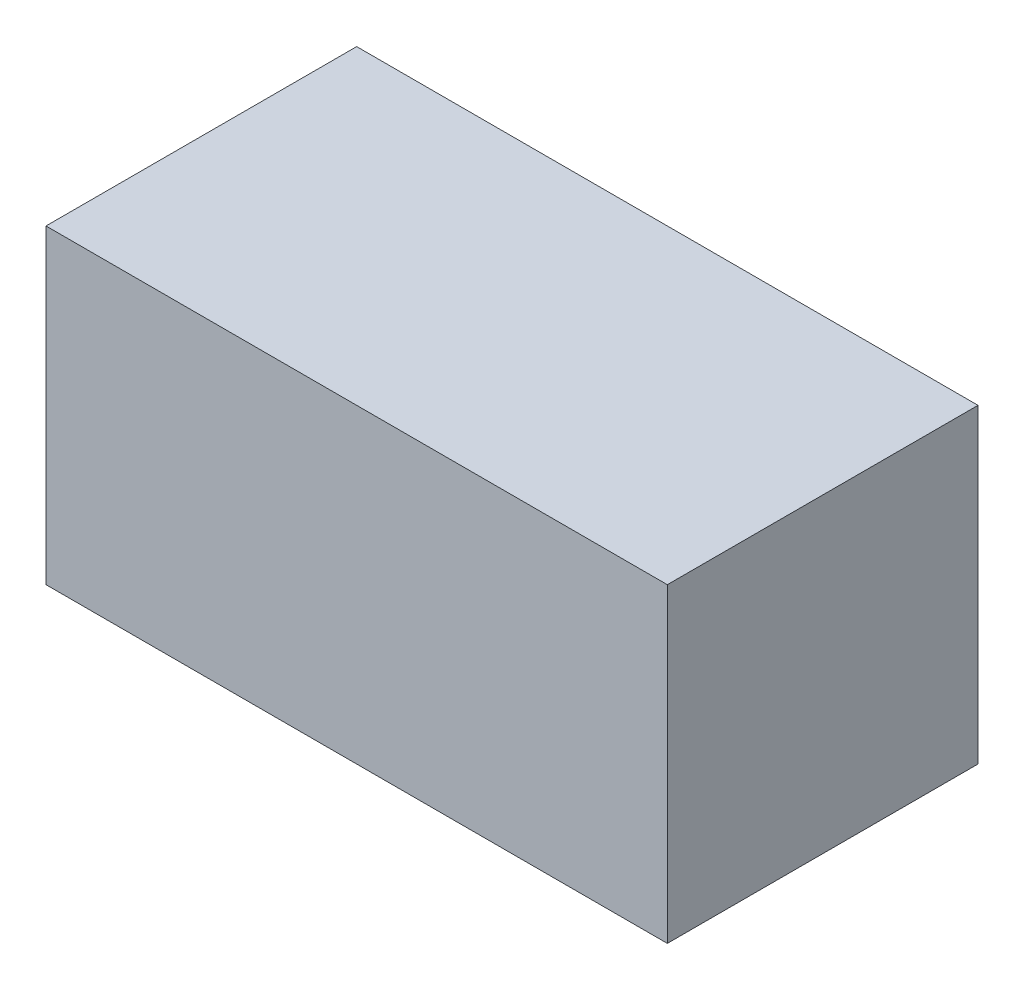
ISO-10303-21;
HEADER;
FILE_DESCRIPTION(('STEP AP214'),'2;1');
FILE_NAME('part.step','',(''),(''),'','','');
FILE_SCHEMA(('AUTOMOTIVE_DESIGN { 1 0 10303 214 1 1 1 1 }'));
ENDSEC;
DATA;
#1=APPLICATION_CONTEXT('core data for automotive mechanical design processes');
#2=APPLICATION_PROTOCOL_DEFINITION('international standard','automotive_design',2000,#1);
#3=PRODUCT_CONTEXT('',#1,'mechanical');
#4=PRODUCT('Part','Part','',(#3));
#5=PRODUCT_RELATED_PRODUCT_CATEGORY('part','',(#4));
#6=PRODUCT_DEFINITION_FORMATION('','',#4);
#7=PRODUCT_DEFINITION_CONTEXT('part definition',#1,'design');
#8=PRODUCT_DEFINITION('design','',#6,#7);
#9=PRODUCT_DEFINITION_SHAPE('','',#8);
#10=(LENGTH_UNIT() NAMED_UNIT(*) SI_UNIT(.MILLI.,.METRE.));
#11=(NAMED_UNIT(*) PLANE_ANGLE_UNIT() SI_UNIT($,.RADIAN.));
#12=(NAMED_UNIT(*) SI_UNIT($,.STERADIAN.) SOLID_ANGLE_UNIT());
#13=UNCERTAINTY_MEASURE_WITH_UNIT(LENGTH_MEASURE(1.E-05),#10,'distance_accuracy_value','');
#14=(GEOMETRIC_REPRESENTATION_CONTEXT(3) GLOBAL_UNCERTAINTY_ASSIGNED_CONTEXT((#13)) GLOBAL_UNIT_ASSIGNED_CONTEXT((#10,
#11,#12)) REPRESENTATION_CONTEXT('',''));
#15=CARTESIAN_POINT('',(0.,0.,0.));
#16=DIRECTION('',(0.,0.,1.));
#17=DIRECTION('',(1.,0.,0.));
#18=AXIS2_PLACEMENT_3D('',#15,#16,#17);
#19=CARTESIAN_POINT('',(0.,10.,0.));
#20=DIRECTION('',(1.,0.,0.));
#21=DIRECTION('',(0.,0.,-1.));
#22=AXIS2_PLACEMENT_3D('',#19,#20,#21);
#23=PLANE('',#22);
#24=DIRECTION('',(0.,0.,1.));
#25=VECTOR('',#24,1.);
#26=CARTESIAN_POINT('',(0.,0.,0.));
#27=LINE('',#26,#25);
#28=CARTESIAN_POINT('',(0.,0.,-10.));
#29=VERTEX_POINT('',#28);
#30=CARTESIAN_POINT('',(0.,0.,0.));
#31=VERTEX_POINT('',#30);
#32=EDGE_CURVE('E96',#29,#31,#27,.T.);
#33=ORIENTED_EDGE('',*,*,#32,.T.);
#34=DIRECTION('',(0.,-1.,0.));
#35=VECTOR('',#34,1.);
#36=CARTESIAN_POINT('',(0.,10.,0.));
#37=LINE('',#36,#35);
#38=CARTESIAN_POINT('',(0.,10.,0.));
#39=VERTEX_POINT('',#38);
#40=EDGE_CURVE('E11',#39,#31,#37,.T.);
#41=ORIENTED_EDGE('',*,*,#40,.F.);
#42=DIRECTION('',(0.,0.,1.));
#43=VECTOR('',#42,1.);
#44=CARTESIAN_POINT('',(0.,10.,0.));
#45=LINE('',#44,#43);
#46=CARTESIAN_POINT('',(0.,10.,-10.));
#47=VERTEX_POINT('',#46);
#48=EDGE_CURVE('E84',#47,#39,#45,.T.);
#49=ORIENTED_EDGE('',*,*,#48,.F.);
#50=DIRECTION('',(0.,-1.,0.));
#51=VECTOR('',#50,1.);
#52=CARTESIAN_POINT('',(0.,10.,-10.));
#53=LINE('',#52,#51);
#54=EDGE_CURVE('E92',#47,#29,#53,.T.);
#55=ORIENTED_EDGE('',*,*,#54,.T.);
#56=EDGE_LOOP('',(#33,#41,#49,#55));
#57=FACE_BOUND('',#56,.T.);
#58=ADVANCED_FACE('F33',(#57),#23,.F.);
#59=CARTESIAN_POINT('',(0.,10.,0.));
#60=DIRECTION('',(0.,0.,-1.));
#61=DIRECTION('',(-1.,0.,0.));
#62=AXIS2_PLACEMENT_3D('',#59,#60,#61);
#63=PLANE('',#62);
#64=DIRECTION('',(1.,0.,0.));
#65=VECTOR('',#64,1.);
#66=CARTESIAN_POINT('',(0.,0.,0.));
#67=LINE('',#66,#65);
#68=CARTESIAN_POINT('',(20.,0.,0.));
#69=VERTEX_POINT('',#68);
#70=EDGE_CURVE('E88',#31,#69,#67,.T.);
#71=ORIENTED_EDGE('',*,*,#70,.T.);
#72=DIRECTION('',(0.,-1.,0.));
#73=VECTOR('',#72,1.);
#74=CARTESIAN_POINT('',(20.,10.,0.));
#75=LINE('',#74,#73);
#76=CARTESIAN_POINT('',(20.,10.,0.));
#77=VERTEX_POINT('',#76);
#78=EDGE_CURVE('E41',#77,#69,#75,.T.);
#79=ORIENTED_EDGE('',*,*,#78,.F.);
#80=DIRECTION('',(1.,0.,0.));
#81=VECTOR('',#80,1.);
#82=CARTESIAN_POINT('',(0.,10.,0.));
#83=LINE('',#82,#81);
#84=EDGE_CURVE('E79',#39,#77,#83,.T.);
#85=ORIENTED_EDGE('',*,*,#84,.F.);
#86=ORIENTED_EDGE('',*,*,#40,.T.);
#87=EDGE_LOOP('',(#71,#79,#85,#86));
#88=FACE_BOUND('',#87,.T.);
#89=ADVANCED_FACE('F87',(#88),#63,.F.);
#90=CARTESIAN_POINT('',(20.,10.,0.));
#91=DIRECTION('',(-1.,0.,0.));
#92=DIRECTION('',(0.,0.,1.));
#93=AXIS2_PLACEMENT_3D('',#90,#91,#92);
#94=PLANE('',#93);
#95=DIRECTION('',(0.,0.,-1.));
#96=VECTOR('',#95,1.);
#97=CARTESIAN_POINT('',(20.,0.,0.));
#98=LINE('',#97,#96);
#99=CARTESIAN_POINT('',(20.,0.,-10.));
#100=VERTEX_POINT('',#99);
#101=EDGE_CURVE('E66',#69,#100,#98,.T.);
#102=ORIENTED_EDGE('',*,*,#101,.T.);
#103=DIRECTION('',(0.,-1.,0.));
#104=VECTOR('',#103,1.);
#105=CARTESIAN_POINT('',(20.,10.,-10.));
#106=LINE('',#105,#104);
#107=CARTESIAN_POINT('',(20.,10.,-10.));
#108=VERTEX_POINT('',#107);
#109=EDGE_CURVE('E89',#108,#100,#106,.T.);
#110=ORIENTED_EDGE('',*,*,#109,.F.);
#111=DIRECTION('',(0.,0.,-1.));
#112=VECTOR('',#111,1.);
#113=CARTESIAN_POINT('',(20.,10.,0.));
#114=LINE('',#113,#112);
#115=EDGE_CURVE('E82',#77,#108,#114,.T.);
#116=ORIENTED_EDGE('',*,*,#115,.F.);
#117=ORIENTED_EDGE('',*,*,#78,.T.);
#118=EDGE_LOOP('',(#102,#110,#116,#117));
#119=FACE_BOUND('',#118,.T.);
#120=ADVANCED_FACE('F90',(#119),#94,.F.);
#121=CARTESIAN_POINT('',(0.,10.,-10.));
#122=DIRECTION('',(0.,0.,1.));
#123=DIRECTION('',(1.,0.,0.));
#124=AXIS2_PLACEMENT_3D('',#121,#122,#123);
#125=PLANE('',#124);
#126=DIRECTION('',(-1.,0.,0.));
#127=VECTOR('',#126,1.);
#128=CARTESIAN_POINT('',(0.,0.,-10.));
#129=LINE('',#128,#127);
#130=EDGE_CURVE('E72',#100,#29,#129,.T.);
#131=ORIENTED_EDGE('',*,*,#130,.T.);
#132=ORIENTED_EDGE('',*,*,#54,.F.);
#133=DIRECTION('',(-1.,0.,0.));
#134=VECTOR('',#133,1.);
#135=CARTESIAN_POINT('',(0.,10.,-10.));
#136=LINE('',#135,#134);
#137=EDGE_CURVE('E49',#108,#47,#136,.T.);
#138=ORIENTED_EDGE('',*,*,#137,.F.);
#139=ORIENTED_EDGE('',*,*,#109,.T.);
#140=EDGE_LOOP('',(#131,#132,#138,#139));
#141=FACE_BOUND('',#140,.T.);
#142=ADVANCED_FACE('F103',(#141),#125,.F.);
#143=CARTESIAN_POINT('',(0.,10.,0.));
#144=DIRECTION('',(0.,-1.,0.));
#145=DIRECTION('',(0.,0.,-1.));
#146=AXIS2_PLACEMENT_3D('',#143,#144,#145);
#147=PLANE('',#146);
#148=ORIENTED_EDGE('',*,*,#48,.T.);
#149=ORIENTED_EDGE('',*,*,#84,.T.);
#150=ORIENTED_EDGE('',*,*,#115,.T.);
#151=ORIENTED_EDGE('',*,*,#137,.T.);
#152=EDGE_LOOP('',(#148,#149,#150,#151));
#153=FACE_BOUND('',#152,.T.);
#154=ADVANCED_FACE('F80',(#153),#147,.F.);
#155=CARTESIAN_POINT('',(0.,0.,0.));
#156=DIRECTION('',(0.,-1.,0.));
#157=DIRECTION('',(0.,0.,-1.));
#158=AXIS2_PLACEMENT_3D('',#155,#156,#157);
#159=PLANE('',#158);
#160=ORIENTED_EDGE('',*,*,#32,.F.);
#161=ORIENTED_EDGE('',*,*,#130,.F.);
#162=ORIENTED_EDGE('',*,*,#101,.F.);
#163=ORIENTED_EDGE('',*,*,#70,.F.);
#164=EDGE_LOOP('',(#160,#161,#162,#163));
#165=FACE_BOUND('',#164,.T.);
#166=ADVANCED_FACE('F106',(#165),#159,.T.);
#167=CLOSED_SHELL('',(#58,#89,#120,#142,#154,#166));
#168=MANIFOLD_SOLID_BREP('B2',#167);
#169=ADVANCED_BREP_SHAPE_REPRESENTATION('',(#18,#168),#14);
#170=SHAPE_DEFINITION_REPRESENTATION(#9,#169);
ENDSEC;
END-ISO-10303-21;
